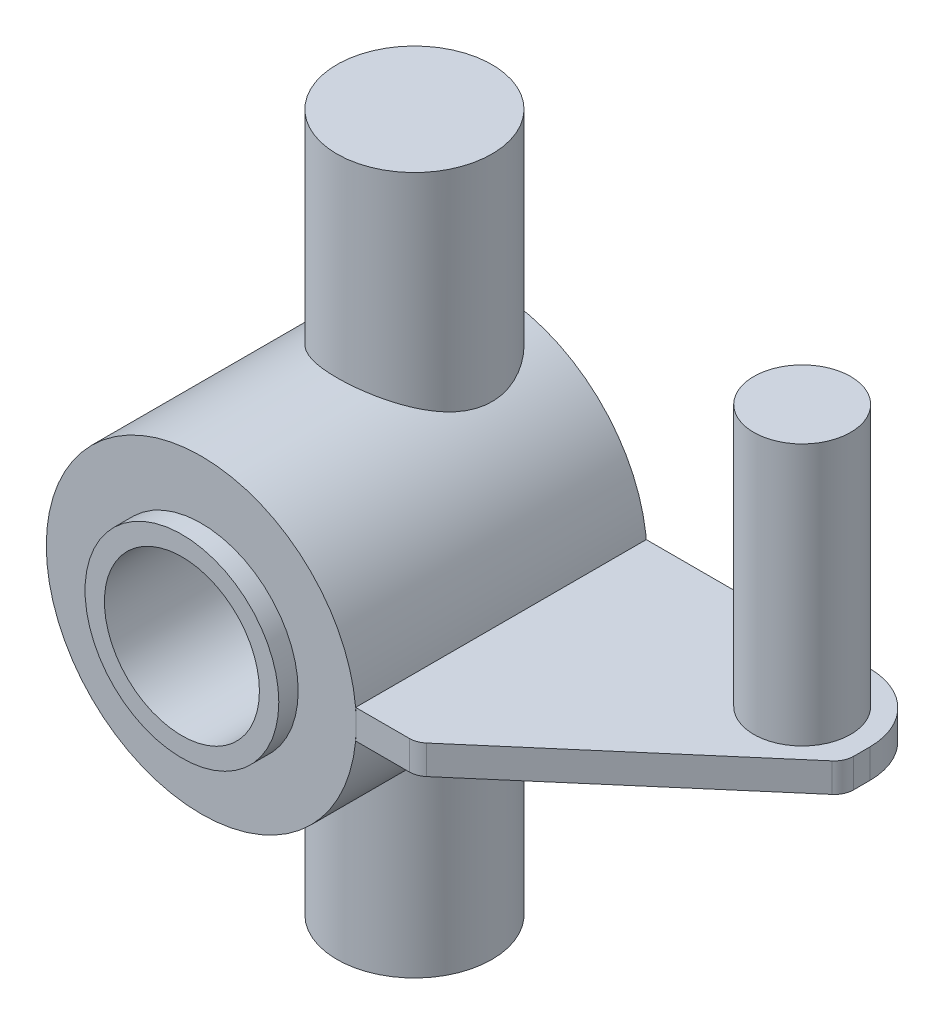
ISO-10303-21;
HEADER;
FILE_DESCRIPTION(('STEP AP214'),'2;1');
FILE_NAME('part.step','',(''),(''),'','','');
FILE_SCHEMA(('AUTOMOTIVE_DESIGN { 1 0 10303 214 1 1 1 1 }'));
ENDSEC;
DATA;
#1=APPLICATION_CONTEXT('core data for automotive mechanical design processes');
#2=APPLICATION_PROTOCOL_DEFINITION('international standard','automotive_design',2000,#1);
#3=PRODUCT_CONTEXT('',#1,'mechanical');
#4=PRODUCT('Part','Part','',(#3));
#5=PRODUCT_RELATED_PRODUCT_CATEGORY('part','',(#4));
#6=PRODUCT_DEFINITION_FORMATION('','',#4);
#7=PRODUCT_DEFINITION_CONTEXT('part definition',#1,'design');
#8=PRODUCT_DEFINITION('design','',#6,#7);
#9=PRODUCT_DEFINITION_SHAPE('','',#8);
#10=(LENGTH_UNIT() NAMED_UNIT(*) SI_UNIT(.MILLI.,.METRE.));
#11=(NAMED_UNIT(*) PLANE_ANGLE_UNIT() SI_UNIT($,.RADIAN.));
#12=(NAMED_UNIT(*) SI_UNIT($,.STERADIAN.) SOLID_ANGLE_UNIT());
#13=UNCERTAINTY_MEASURE_WITH_UNIT(LENGTH_MEASURE(1.E-05),#10,'distance_accuracy_value','');
#14=(GEOMETRIC_REPRESENTATION_CONTEXT(3) GLOBAL_UNCERTAINTY_ASSIGNED_CONTEXT((#13)) GLOBAL_UNIT_ASSIGNED_CONTEXT((#10,
#11,#12)) REPRESENTATION_CONTEXT('',''));
#15=CARTESIAN_POINT('',(0.,0.,0.));
#16=DIRECTION('',(0.,0.,1.));
#17=DIRECTION('',(1.,0.,0.));
#18=AXIS2_PLACEMENT_3D('',#15,#16,#17);
#19=CARTESIAN_POINT('',(23.,0.750000000000004,0.));
#20=DIRECTION('',(0.,-1.,0.));
#21=DIRECTION('',(0.,0.,-1.));
#22=AXIS2_PLACEMENT_3D('',#19,#20,#21);
#23=PLANE('',#22);
#24=CARTESIAN_POINT('',(19.4463189334762,0.750000000000002,3.43499495567666));
#25=DIRECTION('',(0.,-1.,0.));
#26=DIRECTION('',(0.,0.,-1.));
#27=AXIS2_PLACEMENT_3D('',#24,#25,#26);
#28=CIRCLE('',#27,2.5);
#29=CARTESIAN_POINT('',(19.4463189334762,0.750000000000003,0.934994955676659));
#30=VERTEX_POINT('',#29);
#31=EDGE_CURVE('E173',#30,#30,#28,.T.);
#32=ORIENTED_EDGE('',*,*,#31,.T.);
#33=EDGE_LOOP('',(#32));
#34=FACE_BOUND('',#33,.T.);
#35=DIRECTION('',(0.758813097039512,0.,-0.651308439805062));
#36=VECTOR('',#35,1.);
#37=CARTESIAN_POINT('',(25.3687248158512,0.750000000000003,2.75970539256084));
#38=LINE('',#37,#36);
#39=CARTESIAN_POINT('',(11.3890501755666,0.749999999999998,14.7588130970395));
#40=VERTEX_POINT('',#39);
#41=CARTESIAN_POINT('',(22.6513084398051,0.750000000000002,5.09213247781868));
#42=VERTEX_POINT('',#41);
#43=EDGE_CURVE('E121',#40,#42,#38,.T.);
#44=ORIENTED_EDGE('',*,*,#43,.T.);
#45=CARTESIAN_POINT('',(22.,0.750000000000002,4.33331938077917));
#46=DIRECTION('',(0.,-1.,0.));
#47=DIRECTION('',(0.,0.,-1.));
#48=AXIS2_PLACEMENT_3D('',#45,#46,#47);
#49=CIRCLE('',#48,1.);
#50=CARTESIAN_POINT('',(23.,0.750000000000002,4.33331938077917));
#51=VERTEX_POINT('',#50);
#52=EDGE_CURVE('E70',#42,#51,#49,.F.);
#53=ORIENTED_EDGE('',*,*,#52,.T.);
#54=DIRECTION('',(0.,0.,1.));
#55=VECTOR('',#54,1.);
#56=CARTESIAN_POINT('',(23.,0.750000000000004,0.));
#57=LINE('',#56,#55);
#58=CARTESIAN_POINT('',(23.,0.750000000000002,3.5));
#59=VERTEX_POINT('',#58);
#60=EDGE_CURVE('E141',#59,#51,#57,.T.);
#61=ORIENTED_EDGE('',*,*,#60,.F.);
#62=CARTESIAN_POINT('',(19.5,0.750000000000002,3.5));
#63=DIRECTION('',(0.,-1.,0.));
#64=DIRECTION('',(0.,0.,-1.));
#65=AXIS2_PLACEMENT_3D('',#62,#63,#64);
#66=CIRCLE('',#65,3.5);
#67=CARTESIAN_POINT('',(19.5,0.750000000000004,0.));
#68=VERTEX_POINT('',#67);
#69=EDGE_CURVE('E130',#68,#59,#66,.T.);
#70=ORIENTED_EDGE('',*,*,#69,.F.);
#71=DIRECTION('',(-1.,0.,0.));
#72=VECTOR('',#71,1.);
#73=CARTESIAN_POINT('',(23.,0.750000000000004,0.));
#74=LINE('',#73,#72);
#75=CARTESIAN_POINT('',(7.964766161037,0.749999999999998,0.));
#76=VERTEX_POINT('',#75);
#77=EDGE_CURVE('E129',#68,#76,#74,.T.);
#78=ORIENTED_EDGE('',*,*,#77,.T.);
#79=DIRECTION('',(0.,0.,-1.));
#80=VECTOR('',#79,1.);
#81=CARTESIAN_POINT('',(7.964766161037,0.749999999999998,15.));
#82=LINE('',#81,#80);
#83=CARTESIAN_POINT('',(7.964766161037,0.749999999999998,15.));
#84=VERTEX_POINT('',#83);
#85=EDGE_CURVE('E180',#76,#84,#82,.F.);
#86=ORIENTED_EDGE('',*,*,#85,.T.);
#87=DIRECTION('',(-1.,0.,0.));
#88=VECTOR('',#87,1.);
#89=CARTESIAN_POINT('',(23.,0.749999999999998,15.));
#90=LINE('',#89,#88);
#91=CARTESIAN_POINT('',(10.7377417357616,0.749999999999998,15.));
#92=VERTEX_POINT('',#91);
#93=EDGE_CURVE('E139',#92,#84,#90,.T.);
#94=ORIENTED_EDGE('',*,*,#93,.F.);
#95=CARTESIAN_POINT('',(10.7377417357616,0.749999999999999,14.));
#96=DIRECTION('',(0.,-1.,0.));
#97=DIRECTION('',(0.,0.,-1.));
#98=AXIS2_PLACEMENT_3D('',#95,#96,#97);
#99=CIRCLE('',#98,1.);
#100=EDGE_CURVE('E155',#92,#40,#99,.F.);
#101=ORIENTED_EDGE('',*,*,#100,.T.);
#102=EDGE_LOOP('',(#44,#53,#61,#70,#78,#86,#94,#101));
#103=FACE_BOUND('',#102,.T.);
#104=ADVANCED_FACE('F48',(#34,#103),#23,.F.);
#105=CARTESIAN_POINT('',(23.,-0.750000000000004,0.));
#106=DIRECTION('',(0.,1.,0.));
#107=DIRECTION('',(0.,0.,1.));
#108=AXIS2_PLACEMENT_3D('',#105,#106,#107);
#109=PLANE('',#108);
#110=DIRECTION('',(0.,0.,-1.));
#111=VECTOR('',#110,1.);
#112=CARTESIAN_POINT('',(23.,-0.750000000000004,0.));
#113=LINE('',#112,#111);
#114=CARTESIAN_POINT('',(23.,-0.750000000000003,4.33331938077917));
#115=VERTEX_POINT('',#114);
#116=CARTESIAN_POINT('',(23.,-0.750000000000003,3.5));
#117=VERTEX_POINT('',#116);
#118=EDGE_CURVE('E137',#115,#117,#113,.T.);
#119=ORIENTED_EDGE('',*,*,#118,.F.);
#120=CARTESIAN_POINT('',(22.,-0.750000000000004,4.33331938077917));
#121=DIRECTION('',(0.,1.,0.));
#122=DIRECTION('',(0.,0.,1.));
#123=AXIS2_PLACEMENT_3D('',#120,#121,#122);
#124=CIRCLE('',#123,1.);
#125=CARTESIAN_POINT('',(22.6513084398051,-0.750000000000003,5.09213247781868));
#126=VERTEX_POINT('',#125);
#127=EDGE_CURVE('E12',#115,#126,#124,.F.);
#128=ORIENTED_EDGE('',*,*,#127,.T.);
#129=DIRECTION('',(0.758813097039512,0.,-0.651308439805062));
#130=VECTOR('',#129,1.);
#131=CARTESIAN_POINT('',(12.1253865423612,-0.750000000000002,14.1267970022992));
#132=LINE('',#131,#130);
#133=CARTESIAN_POINT('',(11.3890501755666,-0.750000000000002,14.7588130970395));
#134=VERTEX_POINT('',#133);
#135=EDGE_CURVE('E167',#134,#126,#132,.T.);
#136=ORIENTED_EDGE('',*,*,#135,.F.);
#137=CARTESIAN_POINT('',(10.7377417357616,-0.750000000000002,14.));
#138=DIRECTION('',(0.,1.,0.));
#139=DIRECTION('',(0.,0.,1.));
#140=AXIS2_PLACEMENT_3D('',#137,#138,#139);
#141=CIRCLE('',#140,1.);
#142=CARTESIAN_POINT('',(10.7377417357616,-0.750000000000002,15.));
#143=VERTEX_POINT('',#142);
#144=EDGE_CURVE('E151',#134,#143,#141,.F.);
#145=ORIENTED_EDGE('',*,*,#144,.T.);
#146=DIRECTION('',(-1.,0.,0.));
#147=VECTOR('',#146,1.);
#148=CARTESIAN_POINT('',(23.,-0.750000000000002,15.));
#149=LINE('',#148,#147);
#150=CARTESIAN_POINT('',(7.964766161037,-0.750000000000002,15.));
#151=VERTEX_POINT('',#150);
#152=EDGE_CURVE('E136',#143,#151,#149,.T.);
#153=ORIENTED_EDGE('',*,*,#152,.T.);
#154=DIRECTION('',(0.,0.,-1.));
#155=VECTOR('',#154,1.);
#156=CARTESIAN_POINT('',(7.96476616103699,-0.750000000000002,15.));
#157=LINE('',#156,#155);
#158=CARTESIAN_POINT('',(7.964766161037,-0.750000000000002,0.));
#159=VERTEX_POINT('',#158);
#160=EDGE_CURVE('E135',#151,#159,#157,.T.);
#161=ORIENTED_EDGE('',*,*,#160,.T.);
#162=DIRECTION('',(-1.,0.,0.));
#163=VECTOR('',#162,1.);
#164=CARTESIAN_POINT('',(23.,-0.750000000000004,0.));
#165=LINE('',#164,#163);
#166=CARTESIAN_POINT('',(19.5,-0.750000000000004,0.));
#167=VERTEX_POINT('',#166);
#168=EDGE_CURVE('E127',#167,#159,#165,.T.);
#169=ORIENTED_EDGE('',*,*,#168,.F.);
#170=CARTESIAN_POINT('',(19.5,-0.750000000000003,3.5));
#171=DIRECTION('',(0.,-1.,0.));
#172=DIRECTION('',(0.,0.,-1.));
#173=AXIS2_PLACEMENT_3D('',#170,#171,#172);
#174=CIRCLE('',#173,3.5);
#175=EDGE_CURVE('E112',#167,#117,#174,.T.);
#176=ORIENTED_EDGE('',*,*,#175,.T.);
#177=EDGE_LOOP('',(#119,#128,#136,#145,#153,#161,#169,#176));
#178=FACE_BOUND('',#177,.T.);
#179=ADVANCED_FACE('F133',(#178),#109,.F.);
#180=CARTESIAN_POINT('',(23.,-0.750000000000004,0.));
#181=DIRECTION('',(0.,0.,1.));
#182=DIRECTION('',(0.,-1.,0.));
#183=AXIS2_PLACEMENT_3D('',#180,#181,#182);
#184=PLANE('',#183);
#185=ORIENTED_EDGE('',*,*,#77,.F.);
#186=DIRECTION('',(0.,-1.,0.));
#187=VECTOR('',#186,1.);
#188=CARTESIAN_POINT('',(19.5,14.25,0.));
#189=LINE('',#188,#187);
#190=EDGE_CURVE('E115',#68,#167,#189,.T.);
#191=ORIENTED_EDGE('',*,*,#190,.T.);
#192=ORIENTED_EDGE('',*,*,#168,.T.);
#193=CARTESIAN_POINT('',(0.,0.,0.));
#194=DIRECTION('',(0.,0.,-1.));
#195=DIRECTION('',(0.,1.,0.));
#196=AXIS2_PLACEMENT_3D('',#193,#194,#195);
#197=CIRCLE('',#196,8.);
#198=EDGE_CURVE('E179',#159,#76,#197,.F.);
#199=ORIENTED_EDGE('',*,*,#198,.T.);
#200=EDGE_LOOP('',(#185,#191,#192,#199));
#201=FACE_BOUND('',#200,.T.);
#202=ADVANCED_FACE('F125',(#201),#184,.F.);
#203=CARTESIAN_POINT('',(23.,-0.750000000000002,15.));
#204=DIRECTION('',(0.,0.,-1.));
#205=DIRECTION('',(-1.,0.,0.));
#206=AXIS2_PLACEMENT_3D('',#203,#204,#205);
#207=PLANE('',#206);
#208=ORIENTED_EDGE('',*,*,#152,.F.);
#209=DIRECTION('',(0.,-1.,0.));
#210=VECTOR('',#209,1.);
#211=CARTESIAN_POINT('',(10.7377417357616,-0.750000000000004,15.));
#212=LINE('',#211,#210);
#213=EDGE_CURVE('E153',#143,#92,#212,.F.);
#214=ORIENTED_EDGE('',*,*,#213,.T.);
#215=ORIENTED_EDGE('',*,*,#93,.T.);
#216=CARTESIAN_POINT('',(0.,0.,15.));
#217=DIRECTION('',(0.,0.,1.));
#218=DIRECTION('',(1.,0.,0.));
#219=AXIS2_PLACEMENT_3D('',#216,#217,#218);
#220=CIRCLE('',#219,8.);
#221=EDGE_CURVE('E183',#84,#151,#220,.F.);
#222=ORIENTED_EDGE('',*,*,#221,.T.);
#223=EDGE_LOOP('',(#208,#214,#215,#222));
#224=FACE_BOUND('',#223,.T.);
#225=ADVANCED_FACE('F191',(#224),#207,.F.);
#226=CARTESIAN_POINT('',(23.,0.,0.));
#227=DIRECTION('',(1.,0.,0.));
#228=DIRECTION('',(0.,0.,-1.));
#229=AXIS2_PLACEMENT_3D('',#226,#227,#228);
#230=PLANE('',#229);
#231=ORIENTED_EDGE('',*,*,#60,.T.);
#232=DIRECTION('',(0.,1.,0.));
#233=VECTOR('',#232,1.);
#234=CARTESIAN_POINT('',(23.,-0.750000000000002,4.33331938077917));
#235=LINE('',#234,#233);
#236=EDGE_CURVE('E56',#51,#115,#235,.F.);
#237=ORIENTED_EDGE('',*,*,#236,.T.);
#238=ORIENTED_EDGE('',*,*,#118,.T.);
#239=DIRECTION('',(0.,-1.,0.));
#240=VECTOR('',#239,1.);
#241=CARTESIAN_POINT('',(23.,14.25,3.5));
#242=LINE('',#241,#240);
#243=EDGE_CURVE('E118',#59,#117,#242,.T.);
#244=ORIENTED_EDGE('',*,*,#243,.F.);
#245=EDGE_LOOP('',(#231,#237,#238,#244));
#246=FACE_BOUND('',#245,.T.);
#247=ADVANCED_FACE('F186',(#246),#230,.T.);
#248=CARTESIAN_POINT('',(0.,0.,15.));
#249=DIRECTION('',(0.,0.,-1.));
#250=DIRECTION('',(-1.,0.,0.));
#251=AXIS2_PLACEMENT_3D('',#248,#249,#250);
#252=CYLINDRICAL_SURFACE('',#251,8.);
#253=ORIENTED_EDGE('',*,*,#198,.F.);
#254=ORIENTED_EDGE('',*,*,#160,.F.);
#255=ORIENTED_EDGE('',*,*,#221,.F.);
#256=ORIENTED_EDGE('',*,*,#85,.F.);
#257=EDGE_LOOP('',(#253,#254,#255,#256));
#258=FACE_BOUND('',#257,.T.);
#259=ADVANCED_FACE('F218',(#258),#252,.F.);
#260=CARTESIAN_POINT('',(19.5,14.25,3.5));
#261=DIRECTION('',(0.,-1.,0.));
#262=DIRECTION('',(0.,0.,-1.));
#263=AXIS2_PLACEMENT_3D('',#260,#261,#262);
#264=CYLINDRICAL_SURFACE('',#263,3.5);
#265=ORIENTED_EDGE('',*,*,#69,.T.);
#266=ORIENTED_EDGE('',*,*,#243,.T.);
#267=ORIENTED_EDGE('',*,*,#175,.F.);
#268=ORIENTED_EDGE('',*,*,#190,.F.);
#269=EDGE_LOOP('',(#265,#266,#267,#268));
#270=FACE_BOUND('',#269,.T.);
#271=ADVANCED_FACE('F114',(#270),#264,.T.);
#272=CARTESIAN_POINT('',(12.1253865423612,14.25,14.1267970022992));
#273=DIRECTION('',(-0.651308439805062,0.,-0.758813097039512));
#274=DIRECTION('',(-0.758813097039512,0.,0.651308439805062));
#275=AXIS2_PLACEMENT_3D('',#272,#273,#274);
#276=PLANE('',#275);
#277=ORIENTED_EDGE('',*,*,#135,.T.);
#278=DIRECTION('',(0.,1.,0.));
#279=VECTOR('',#278,1.);
#280=CARTESIAN_POINT('',(22.6513084398051,0.750000000000003,5.09213247781868));
#281=LINE('',#280,#279);
#282=EDGE_CURVE('E157',#126,#42,#281,.T.);
#283=ORIENTED_EDGE('',*,*,#282,.T.);
#284=ORIENTED_EDGE('',*,*,#43,.F.);
#285=DIRECTION('',(0.,-1.,0.));
#286=VECTOR('',#285,1.);
#287=CARTESIAN_POINT('',(11.3890501755666,14.25,14.7588130970395));
#288=LINE('',#287,#286);
#289=EDGE_CURVE('E148',#40,#134,#288,.T.);
#290=ORIENTED_EDGE('',*,*,#289,.T.);
#291=EDGE_LOOP('',(#277,#283,#284,#290));
#292=FACE_BOUND('',#291,.T.);
#293=ADVANCED_FACE('F164',(#292),#276,.F.);
#294=CARTESIAN_POINT('',(10.7377417357616,14.25,14.));
#295=DIRECTION('',(0.,-1.,0.));
#296=DIRECTION('',(1.,0.,0.));
#297=AXIS2_PLACEMENT_3D('',#294,#295,#296);
#298=CYLINDRICAL_SURFACE('',#297,1.);
#299=ORIENTED_EDGE('',*,*,#100,.F.);
#300=ORIENTED_EDGE('',*,*,#213,.F.);
#301=ORIENTED_EDGE('',*,*,#144,.F.);
#302=ORIENTED_EDGE('',*,*,#289,.F.);
#303=EDGE_LOOP('',(#299,#300,#301,#302));
#304=FACE_BOUND('',#303,.T.);
#305=ADVANCED_FACE('F193',(#304),#298,.T.);
#306=CARTESIAN_POINT('',(22.,14.25,4.33331938077917));
#307=DIRECTION('',(0.,-1.,0.));
#308=DIRECTION('',(0.,0.,-1.));
#309=AXIS2_PLACEMENT_3D('',#306,#307,#308);
#310=CYLINDRICAL_SURFACE('',#309,1.);
#311=ORIENTED_EDGE('',*,*,#127,.F.);
#312=ORIENTED_EDGE('',*,*,#236,.F.);
#313=ORIENTED_EDGE('',*,*,#52,.F.);
#314=ORIENTED_EDGE('',*,*,#282,.F.);
#315=EDGE_LOOP('',(#311,#312,#313,#314));
#316=FACE_BOUND('',#315,.T.);
#317=ADVANCED_FACE('F50',(#316),#310,.T.);
#318=CARTESIAN_POINT('',(19.4463189334762,14.25,3.43499495567666));
#319=DIRECTION('',(0.,-1.,0.));
#320=DIRECTION('',(0.,0.,-1.));
#321=AXIS2_PLACEMENT_3D('',#318,#319,#320);
#322=CYLINDRICAL_SURFACE('',#321,2.5);
#323=CARTESIAN_POINT('',(19.4463189334762,14.25,3.43499495567666));
#324=DIRECTION('',(0.,-1.,0.));
#325=DIRECTION('',(0.,0.,-1.));
#326=AXIS2_PLACEMENT_3D('',#323,#324,#325);
#327=CIRCLE('',#326,2.5);
#328=CARTESIAN_POINT('',(19.4463189334762,14.25,0.934994955676657));
#329=VERTEX_POINT('',#328);
#330=EDGE_CURVE('E238',#329,#329,#327,.T.);
#331=ORIENTED_EDGE('',*,*,#330,.T.);
#332=EDGE_LOOP('',(#331));
#333=FACE_BOUND('',#332,.T.);
#334=ORIENTED_EDGE('',*,*,#31,.F.);
#335=EDGE_LOOP('',(#334));
#336=FACE_BOUND('',#335,.T.);
#337=ADVANCED_FACE('F199',(#333,#336),#322,.T.);
#338=CARTESIAN_POINT('',(19.4463189334762,14.25,3.43499495567666));
#339=DIRECTION('',(0.,-1.,0.));
#340=DIRECTION('',(0.,0.,-1.));
#341=AXIS2_PLACEMENT_3D('',#338,#339,#340);
#342=PLANE('',#341);
#343=ORIENTED_EDGE('',*,*,#330,.F.);
#344=EDGE_LOOP('',(#343));
#345=FACE_BOUND('',#344,.T.);
#346=ADVANCED_FACE('F230',(#345),#342,.F.);
#347=CLOSED_SHELL('',(#104,#179,#202,#225,#247,#259,#271,#293,#305,#317,#337,#346));
#348=MANIFOLD_SOLID_BREP('B2',#347);
#349=CARTESIAN_POINT('',(0.,18.,4.));
#350=DIRECTION('',(0.,-1.,0.));
#351=DIRECTION('',(0.,0.,-1.));
#352=AXIS2_PLACEMENT_3D('',#349,#350,#351);
#353=CYLINDRICAL_SURFACE('',#352,4.);
#354=CARTESIAN_POINT('',(0.,18.,4.));
#355=DIRECTION('',(0.,1.,0.));
#356=DIRECTION('',(0.,0.,1.));
#357=AXIS2_PLACEMENT_3D('',#354,#355,#356);
#358=CIRCLE('',#357,4.);
#359=CARTESIAN_POINT('',(0.,18.,8.));
#360=VERTEX_POINT('',#359);
#361=EDGE_CURVE('E47',#360,#360,#358,.T.);
#362=ORIENTED_EDGE('',*,*,#361,.F.);
#363=EDGE_LOOP('',(#362));
#364=FACE_BOUND('',#363,.T.);
#365=CARTESIAN_POINT('',(0.,8.,8.));
#366=CARTESIAN_POINT('',(0.105191216468488,7.99999964432188,7.99999959515221));
#367=CARTESIAN_POINT('',(0.210389995368427,7.99792027620652,7.99584554268467));
#368=CARTESIAN_POINT('',(0.420011249701336,7.98965597150982,7.97927792190077));
#369=CARTESIAN_POINT('',(0.524433367425618,7.98346924887743,7.96686076043045));
#370=CARTESIAN_POINT('',(0.731828138370605,7.96713597659603,7.93388648530473));
#371=CARTESIAN_POINT('',(0.834798506711917,7.95698378017499,7.9133177633431));
#372=CARTESIAN_POINT('',(1.0384152051955,7.93298382243633,7.86428279244356));
#373=CARTESIAN_POINT('',(1.1390605669938,7.91913455043164,7.83581331493588));
#374=CARTESIAN_POINT('',(1.43561775388138,7.87265974292142,7.73925176888222));
#375=CARTESIAN_POINT('',(1.6271962065847,7.83501976471674,7.65983701915264));
#376=CARTESIAN_POINT('',(1.99392146995421,7.74982886318845,7.47371095891235));
#377=CARTESIAN_POINT('',(2.16906957469774,7.70227872135526,7.36700180061893));
#378=CARTESIAN_POINT('',(2.51002321260362,7.59825056785886,7.12193017740055));
#379=CARTESIAN_POINT('',(2.67462250306452,7.54140647262265,6.98204331180567));
#380=CARTESIAN_POINT('',(2.97911611963431,7.42640030348014,6.67792486241435));
#381=CARTESIAN_POINT('',(3.11899161990724,7.3682372629647,6.51367490095672));
#382=CARTESIAN_POINT('',(3.38102385527715,7.25195135134797,6.15002101287013));
#383=CARTESIAN_POINT('',(3.50096528772936,7.19418138823907,5.94887869572524));
#384=CARTESIAN_POINT('',(3.65378721735264,7.11709930290977,5.63206546004573));
#385=CARTESIAN_POINT('',(3.70022392693971,7.09299422837207,5.5239053371934));
#386=CARTESIAN_POINT('',(3.78359067078057,7.04887690211806,5.30319902892111));
#387=CARTESIAN_POINT('',(3.82052633371565,7.02886222858683,5.19065548607789));
#388=CARTESIAN_POINT('',(3.88251046204454,6.9948044998643,4.96880578069376));
#389=CARTESIAN_POINT('',(3.9081340887804,6.9804776446802,4.85970358083543));
#390=CARTESIAN_POINT('',(3.95018060072941,6.95677065788593,4.63925947717983));
#391=CARTESIAN_POINT('',(3.96660836750271,6.9473879018896,4.52791879424739));
#392=CARTESIAN_POINT('',(3.99001913809428,6.93396933490057,4.30399390653389));
#393=CARTESIAN_POINT('',(3.99700782997252,6.92993030376772,4.19141049191159));
#394=CARTESIAN_POINT('',(4.00144340059851,6.92737022415464,3.96599952196127));
#395=CARTESIAN_POINT('',(3.99889118971828,6.92884864921082,3.853171990953));
#396=CARTESIAN_POINT('',(3.98516575152016,6.93675038555112,3.64183562155368));
#397=CARTESIAN_POINT('',(3.97506329407581,6.94255931040713,3.54323256042783));
#398=CARTESIAN_POINT('',(3.94763759493625,6.95818925294571,3.34734838783369));
#399=CARTESIAN_POINT('',(3.93031208534669,6.96801153072177,3.2500677014795));
#400=CARTESIAN_POINT('',(3.86777248849784,7.00304835203764,2.96122086709978));
#401=CARTESIAN_POINT('',(3.81198555026409,7.03383903740602,2.77250454291879));
#402=CARTESIAN_POINT('',(3.67283599572519,7.10749917506982,2.4030536672292));
#403=CARTESIAN_POINT('',(3.58886132884632,7.15063327143764,2.22260742465183));
#404=CARTESIAN_POINT('',(3.39616568981264,7.2441365265382,1.87746981298511));
#405=CARTESIAN_POINT('',(3.28743360222607,7.29450893132236,1.71278556793507));
#406=CARTESIAN_POINT('',(3.03227252755196,7.40452458073482,1.38191711829539));
#407=CARTESIAN_POINT('',(2.88281182497071,7.46453347888883,1.21819042929159));
#408=CARTESIAN_POINT('',(2.55818830727484,7.58191186589975,0.917040393499512));
#409=CARTESIAN_POINT('',(2.38301327894514,7.63928008344308,0.779629617525468));
#410=CARTESIAN_POINT('',(2.09944472683198,7.7202760768617,0.593246969785754));
#411=CARTESIAN_POINT('',(1.9989679987013,7.74696304862188,0.533318240246936));
#412=CARTESIAN_POINT('',(1.79256850112001,7.79730441532266,0.42223352122335));
#413=CARTESIAN_POINT('',(1.68664805204876,7.82096008757468,0.37107383360208));
#414=CARTESIAN_POINT('',(1.47010242051538,7.86454042959534,0.278080877627199));
#415=CARTESIAN_POINT('',(1.35947915341347,7.88446660078232,0.236243854867457));
#416=CARTESIAN_POINT('',(1.13432950721217,7.91999221203723,0.162380061448199));
#417=CARTESIAN_POINT('',(1.01980357880328,7.9355921498224,0.130352162240849));
#418=CARTESIAN_POINT('',(0.797438403015335,7.96087677585623,0.0787731521448827));
#419=CARTESIAN_POINT('',(0.68983090685457,7.9709443603734,0.058408402943018));
#420=CARTESIAN_POINT('',(0.472998720376382,7.98674429615844,0.0265535517575012));
#421=CARTESIAN_POINT('',(0.363774173887724,7.99247703065614,0.0150626652629393));
#422=CARTESIAN_POINT('',(0.144648447401173,7.99944300548302,0.00110952845549016));
#423=CARTESIAN_POINT('',(0.0347475425961453,8.00067796839692,-0.00135617837901456));
#424=CARTESIAN_POINT('',(-0.184837638972486,7.99861804620746,0.00276424211008771));
#425=CARTESIAN_POINT('',(-0.294521925108021,7.99532336157662,0.00934996883659231));
#426=CARTESIAN_POINT('',(-0.504259611746538,7.98472734940324,0.0306235695271645));
#427=CARTESIAN_POINT('',(-0.604398259266984,7.97775776257091,0.0446410691044307));
#428=CARTESIAN_POINT('',(-0.803035609307668,7.96021983565123,0.0801363996639103));
#429=CARTESIAN_POINT('',(-0.901533743070587,7.94965027363514,0.101616763793442));
#430=CARTESIAN_POINT('',(-1.19351737727532,7.91289127905722,0.176935173599938));
#431=CARTESIAN_POINT('',(-1.38368108667204,7.88164133135127,0.241670140590663));
#432=CARTESIAN_POINT('',(-1.75558493783058,7.80736894774679,0.399998108905637));
#433=CARTESIAN_POINT('',(-1.93692876519228,7.76403545540105,0.494363309171963));
#434=CARTESIAN_POINT('',(-2.28183826656572,7.66975878800211,0.708431034259749));
#435=CARTESIAN_POINT('',(-2.44539632212196,7.61881237399843,0.828144352631561));
#436=CARTESIAN_POINT('',(-2.76706877708067,7.50833088367007,1.10303311970347));
#437=CARTESIAN_POINT('',(-2.92307134240145,7.44844369061623,1.26053653725913));
#438=CARTESIAN_POINT('',(-3.20744226426287,7.33048735856255,1.5997355652547));
#439=CARTESIAN_POINT('',(-3.33579150415337,7.27241950081065,1.7814477716031));
#440=CARTESIAN_POINT('',(-3.50772930633183,7.19028164087441,2.0739940144221));
#441=CARTESIAN_POINT('',(-3.5626157867948,7.16316684054651,2.17748375843627));
#442=CARTESIAN_POINT('',(-3.66334616154282,7.11217812644117,2.38951843531651));
#443=CARTESIAN_POINT('',(-3.70919441458265,7.08830265221425,2.49806090009515));
#444=CARTESIAN_POINT('',(-3.79131200961919,7.04472262103751,2.71942164536428));
#445=CARTESIAN_POINT('',(-3.82758904080802,7.02501471854545,2.83223640979536));
#446=CARTESIAN_POINT('',(-3.89012004539429,6.9905825381999,3.06135278907153));
#447=CARTESIAN_POINT('',(-3.91637557070638,6.97585748874971,3.17765386102154));
#448=CARTESIAN_POINT('',(-3.95643062416587,6.95321025619991,3.40141213316309));
#449=CARTESIAN_POINT('',(-3.97118378192521,6.94477079792059,3.50864683290839));
#450=CARTESIAN_POINT('',(-3.99195118317071,6.93285441469714,3.72422767020064));
#451=CARTESIAN_POINT('',(-3.99796634225491,6.92937696981658,3.8325736901013));
#452=CARTESIAN_POINT('',(-4.00116308319383,6.92753208063799,4.04940749673038));
#453=CARTESIAN_POINT('',(-3.99834777004019,6.9291628401807,4.15789522022328));
#454=CARTESIAN_POINT('',(-3.98394653809981,6.9374509348198,4.37406114711354));
#455=CARTESIAN_POINT('',(-3.97236097836303,6.94410806413885,4.48173938346867));
#456=CARTESIAN_POINT('',(-3.92770249100378,6.96952879582861,4.7818001370413));
#457=CARTESIAN_POINT('',(-3.88483285002042,6.99372760142387,4.97236586731381));
#458=CARTESIAN_POINT('',(-3.77270184038046,7.05483682415845,5.34326850255324));
#459=CARTESIAN_POINT('',(-3.70343198216887,7.09175132993569,5.52360209570391));
#460=CARTESIAN_POINT('',(-3.53526338936952,7.17714225279385,5.882488553514));
#461=CARTESIAN_POINT('',(-3.43468670285354,7.22622883383996,6.06010777576172));
#462=CARTESIAN_POINT('',(-3.20860173383709,7.3294133274236,6.39710197827703));
#463=CARTESIAN_POINT('',(-3.08308048046464,7.38351383930109,6.55646739854074));
#464=CARTESIAN_POINT('',(-2.79282250805389,7.49849148240842,6.8725629090385));
#465=CARTESIAN_POINT('',(-2.62517402605099,7.55939328373464,7.02661992962373));
#466=CARTESIAN_POINT('',(-2.26458287075638,7.67511613929542,7.3050684228129));
#467=CARTESIAN_POINT('',(-2.07162664990559,7.72993390744395,7.42944390524207));
#468=CARTESIAN_POINT('',(-1.76603106757846,7.80335210517359,7.59090424941519));
#469=CARTESIAN_POINT('',(-1.66100410373827,7.82643367929072,7.64069364140905));
#470=CARTESIAN_POINT('',(-1.44639623629744,7.8689179624278,7.73114894700146));
#471=CARTESIAN_POINT('',(-1.33681760142932,7.88832247803741,7.77181934269804));
#472=CARTESIAN_POINT('',(-1.11415600876093,7.92283587265691,7.84347634443401));
#473=CARTESIAN_POINT('',(-1.00108129646084,7.93795411409434,7.87448407138671));
#474=CARTESIAN_POINT('',(-0.772189766950842,7.96347694583626,7.92651008001648));
#475=CARTESIAN_POINT('',(-0.656374670304615,7.97388441530454,7.94753446377235));
#476=CARTESIAN_POINT('',(-0.450433316283305,7.98781110043795,7.97557962119869));
#477=CARTESIAN_POINT('',(-0.360660623567813,7.99237392421376,7.98472938917604));
#478=CARTESIAN_POINT('',(-0.180593821057088,7.99846856848791,7.99693983637807));
#479=CARTESIAN_POINT('',(-0.0902996969389666,8.00000030532612,8.00000034753503));
#480=CARTESIAN_POINT('',(0.,8.,8.));
#481=B_SPLINE_CURVE_WITH_KNOTS('',3,(#365,#366,#367,#368,#369,#370,#371,#372,#373,#374,#375,
#376,#377,#378,#379,#380,#381,#382,#383,#384,#385,#386,#387,#388,#389,#390,#391,#392,#393,#394,
#395,#396,#397,#398,#399,#400,#401,#402,#403,#404,#405,#406,#407,#408,#409,#410,#411,#412,#413,
#414,#415,#416,#417,#418,#419,#420,#421,#422,#423,#424,#425,#426,#427,#428,#429,#430,#431,#432,
#433,#434,#435,#436,#437,#438,#439,#440,#441,#442,#443,#444,#445,#446,#447,#448,#449,#450,#451,
#452,#453,#454,#455,#456,#457,#458,#459,#460,#461,#462,#463,#464,#465,#466,#467,#468,#469,#470,
#471,#472,#473,#474,#475,#476,#477,#478,#479,#480),.UNSPECIFIED.,.T.,.F.,(4,2,2,2,2,2,2,2,2,2,2,
2,2,2,2,2,2,2,2,2,2,2,2,2,2,2,2,2,2,2,2,2,2,2,2,2,2,2,2,2,2,2,2,2,2,2,2,2,2,2,2,2,2,2,2,2,2,4),
(0.,0.315484235719912,0.631105747230253,0.947178346952276,1.26338029745354,1.89263632058595,
2.52184274094302,3.18911473348911,3.85689264923289,4.57645675584686,4.93648208726456,
5.29629363598333,5.63476191634051,5.97305035229576,6.31113484191767,6.64918707308226,
6.94669148652859,7.24428938086225,7.83905304157541,8.44767049128776,9.05656173495714,
9.74265853790341,10.4290822684957,10.7886699173095,11.1481055433964,11.5073961555811,
11.8666454155399,12.1961419049363,12.5256092612256,12.8549504227676,13.184277008843,
13.4879760335491,13.791778244799,14.3988188497914,15.02321622567,15.6478800144877,
16.33388641032,17.0203655291613,17.380682030865,17.7408243397693,18.1006764355618,
18.4604727825931,18.7857371805984,19.1109674938045,19.4360834615763,19.7611861199664,
20.3488209353335,20.9366448769134,21.5639619965908,22.1916061711245,22.8955134356508,
23.5997990605888,23.9548906509477,24.3098073249809,24.6639426811876,25.0178613011449,
25.2886761616556,25.5594984967416),.UNSPECIFIED.);
#482=CARTESIAN_POINT('',(0.,8.,8.));
#483=VERTEX_POINT('',#482);
#484=EDGE_CURVE('E324',#483,#483,#481,.T.);
#485=ORIENTED_EDGE('',*,*,#484,.T.);
#486=EDGE_LOOP('',(#485));
#487=FACE_BOUND('',#486,.T.);
#488=ADVANCED_FACE('F318',(#364,#487),#353,.T.);
#489=CARTESIAN_POINT('',(0.,18.,4.));
#490=DIRECTION('',(0.,1.,0.));
#491=DIRECTION('',(0.,0.,1.));
#492=AXIS2_PLACEMENT_3D('',#489,#490,#491);
#493=PLANE('',#492);
#494=ORIENTED_EDGE('',*,*,#361,.T.);
#495=EDGE_LOOP('',(#494));
#496=FACE_BOUND('',#495,.T.);
#497=ADVANCED_FACE('F339',(#496),#493,.T.);
#498=CARTESIAN_POINT('',(0.,0.,15.));
#499=DIRECTION('',(0.,0.,-1.));
#500=DIRECTION('',(-1.,0.,0.));
#501=AXIS2_PLACEMENT_3D('',#498,#499,#500);
#502=CYLINDRICAL_SURFACE('',#501,8.);
#503=ORIENTED_EDGE('',*,*,#484,.F.);
#504=EDGE_LOOP('',(#503));
#505=FACE_BOUND('',#504,.T.);
#506=ADVANCED_FACE('F336',(#505),#502,.F.);
#507=CLOSED_SHELL('',(#488,#497,#506));
#508=MANIFOLD_SOLID_BREP('B6',#507);
#509=CARTESIAN_POINT('',(0.,0.,15.));
#510=DIRECTION('',(0.,0.,-1.));
#511=DIRECTION('',(-1.,0.,0.));
#512=AXIS2_PLACEMENT_3D('',#509,#510,#511);
#513=CYLINDRICAL_SURFACE('',#512,8.);
#514=CARTESIAN_POINT('',(0.,0.,15.));
#515=DIRECTION('',(0.,0.,1.));
#516=DIRECTION('',(1.,0.,0.));
#517=AXIS2_PLACEMENT_3D('',#514,#515,#516);
#518=CIRCLE('',#517,8.);
#519=CARTESIAN_POINT('',(8.,0.,15.));
#520=VERTEX_POINT('',#519);
#521=EDGE_CURVE('E316',#520,#520,#518,.T.);
#522=ORIENTED_EDGE('',*,*,#521,.F.);
#523=EDGE_LOOP('',(#522));
#524=FACE_BOUND('',#523,.T.);
#525=CARTESIAN_POINT('',(0.,0.,0.));
#526=DIRECTION('',(0.,0.,1.));
#527=DIRECTION('',(1.,0.,0.));
#528=AXIS2_PLACEMENT_3D('',#525,#526,#527);
#529=CIRCLE('',#528,8.);
#530=CARTESIAN_POINT('',(0.,-8.,0.));
#531=VERTEX_POINT('',#530);
#532=EDGE_CURVE('E371',#531,#531,#529,.T.);
#533=ORIENTED_EDGE('',*,*,#532,.T.);
#534=CARTESIAN_POINT('',(4.00000000000001,-6.9282032302755,4.));
#535=CARTESIAN_POINT('',(3.99999950219345,-6.92820386262826,4.1042653254373));
#536=CARTESIAN_POINT('',(3.9959176319954,-6.93056511456488,4.20853992667939));
#537=CARTESIAN_POINT('',(3.97964472112407,-6.93992172463862,4.41628417460038));
#538=CARTESIAN_POINT('',(3.96744990521399,-6.94691924018481,4.51975342383269));
#539=CARTESIAN_POINT('',(3.93508538297522,-6.96530330045203,4.72521084556988));
#540=CARTESIAN_POINT('',(3.91490316893164,-6.97669672816262,4.82719643382953));
#541=CARTESIAN_POINT('',(3.86682062971259,-7.00345973447504,5.02881400167829));
#542=CARTESIAN_POINT('',(3.83891695064122,-7.01883104071991,5.12844493804267));
#543=CARTESIAN_POINT('',(3.74442772916635,-7.06996541785761,5.42168896600919));
#544=CARTESIAN_POINT('',(3.66684915651286,-7.11087904783325,5.61098585661696));
#545=CARTESIAN_POINT('',(3.4850607538011,-7.20170927952067,5.97372956380103));
#546=CARTESIAN_POINT('',(3.38084948302617,-7.25162636823861,6.14717552221941));
#547=CARTESIAN_POINT('',(3.13867639492106,-7.3598722626408,6.48920849434794));
#548=CARTESIAN_POINT('',(2.99863981046009,-7.41855528289904,6.65621486644762));
#549=CARTESIAN_POINT('',(2.69298354883076,-7.53488657765781,6.96565524064934));
#550=CARTESIAN_POINT('',(2.52735118809494,-7.59253432325008,7.10807698576393));
#551=CARTESIAN_POINT('',(2.25626437810993,-7.6758759355965,7.30498206648215));
#552=CARTESIAN_POINT('',(2.15870290429516,-7.70394919240218,7.36953226161913));
#553=CARTESIAN_POINT('',(1.95777427065883,-7.75744193796062,7.49010444022811));
#554=CARTESIAN_POINT('',(1.85440960246324,-7.78286255243594,7.54613004600924));
#555=CARTESIAN_POINT('',(1.64251485422607,-7.83032159918279,7.64911278165759));
#556=CARTESIAN_POINT('',(1.53398485456802,-7.85236008406491,7.6960700525899));
#557=CARTESIAN_POINT('',(1.3125858096749,-7.89238619731919,7.78036194826573));
#558=CARTESIAN_POINT('',(1.19971924732416,-7.91037610439248,7.81770198768932));
#559=CARTESIAN_POINT('',(0.978622575683248,-7.94064573590697,7.88001829427466));
#560=CARTESIAN_POINT('',(0.870629018183695,-7.95323930006917,7.90568215305844));
#561=CARTESIAN_POINT('',(0.652524088435726,-7.97409583861317,7.94797970743347));
#562=CARTESIAN_POINT('',(0.542413779814414,-7.98236093189931,7.96461782151572));
#563=CARTESIAN_POINT('',(0.320973525125338,-7.99432715952591,7.98865586699747));
#564=CARTESIAN_POINT('',(0.209643937931229,-7.99802960221736,7.99605844671614));
#565=CARTESIAN_POINT('',(-0.0132971447801722,-8.0007656004484,8.00153168636999));
#566=CARTESIAN_POINT('',(-0.124908622632314,-7.99979944163708,7.99960291724515));
#567=CARTESIAN_POINT('',(-0.337727985342423,-7.99351360464185,7.98701479129273));
#568=CARTESIAN_POINT('',(-0.438993817716938,-7.98858118408677,7.97713197765086));
#569=CARTESIAN_POINT('',(-0.640243249291353,-7.97497880011988,7.94973672090394));
#570=CARTESIAN_POINT('',(-0.740226424897065,-7.96630763313356,7.93222182086393));
#571=CARTESIAN_POINT('',(-1.03714138295469,-7.93497195498556,7.86848947730556));
#572=CARTESIAN_POINT('',(-1.23123936013571,-7.9069787607081,7.81107210299894));
#573=CARTESIAN_POINT('',(-1.6092687156014,-7.83886272517952,7.6676660261144));
#574=CARTESIAN_POINT('',(-1.79302228049015,-7.79857742343273,7.58129301759658));
#575=CARTESIAN_POINT('',(-2.14389861654609,-7.70950607728793,7.38294806552919));
#576=CARTESIAN_POINT('',(-2.31101540282593,-7.66071699099023,7.27096695718556));
#577=CARTESIAN_POINT('',(-2.64069813790284,-7.55377539869557,7.01241508000272));
#578=CARTESIAN_POINT('',(-2.80134064782814,-7.49517374441381,6.86357523984661));
#579=CARTESIAN_POINT('',(-3.096413130151,-7.37817491997775,6.54165375681343));
#580=CARTESIAN_POINT('',(-3.23082293513642,-7.31977794078033,6.36855363717567));
#581=CARTESIAN_POINT('',(-3.47803613314163,-7.20576112808083,5.98935711133187));
#582=CARTESIAN_POINT('',(-3.58892539602577,-7.15055315383099,5.78186338145237));
#583=CARTESIAN_POINT('',(-3.72723782010754,-7.07886925416584,5.45658261556123));
#584=CARTESIAN_POINT('',(-3.76867730715225,-7.05682593849463,5.34579164080266));
#585=CARTESIAN_POINT('',(-3.84175062064906,-7.01731299636541,5.12025515321879));
#586=CARTESIAN_POINT('',(-3.87339049322799,-6.99984055082838,5.00551212747387));
#587=CARTESIAN_POINT('',(-3.92431909326376,-6.97140602598867,4.78217133548265));
#588=CARTESIAN_POINT('',(-3.94438433855718,-6.96003957007805,4.67380134853994));
#589=CARTESIAN_POINT('',(-3.97551851361913,-6.94230335544128,4.45541909952217));
#590=CARTESIAN_POINT('',(-3.98659212183613,-6.93593099829036,4.34540772186559));
#591=CARTESIAN_POINT('',(-3.99958291311108,-6.92844811909925,4.12470748996731));
#592=CARTESIAN_POINT('',(-4.00150350567567,-6.92733563775176,4.01401890337321));
#593=CARTESIAN_POINT('',(-3.99616718095744,-6.93041539174955,3.79294330689436));
#594=CARTESIAN_POINT('',(-3.98891088315149,-6.93460726902939,3.68255627715739));
#595=CARTESIAN_POINT('',(-3.96663154579714,-6.94737197203376,3.47513061602036));
#596=CARTESIAN_POINT('',(-3.95254845698989,-6.95541341326253,3.3779567889877));
#597=CARTESIAN_POINT('',(-3.91737385475212,-6.97528372672039,3.18526806656622));
#598=CARTESIAN_POINT('',(-3.89628002700134,-6.98711384958699,3.08975372996381));
#599=CARTESIAN_POINT('',(-3.82280238446313,-7.02775685901555,2.80663196389194));
#600=CARTESIAN_POINT('',(-3.76020731695077,-7.06173163693377,2.62230856572734));
#601=CARTESIAN_POINT('',(-3.60658595732554,-7.14144993292041,2.25832541229841));
#602=CARTESIAN_POINT('',(-3.51437713951607,-7.18766564346826,2.07927704666103));
#603=CARTESIAN_POINT('',(-3.30514737086267,-7.28624486618866,1.73812980331287));
#604=CARTESIAN_POINT('',(-3.18811367399407,-7.33861153030439,1.57603969669191));
#605=CARTESIAN_POINT('',(-2.91535761342628,-7.45151836616993,1.25208687714178));
#606=CARTESIAN_POINT('',(-2.75661800037809,-7.51225675092662,1.09282841283409));
#607=CARTESIAN_POINT('',(-2.41358105803055,-7.62937597657745,0.802334026584154));
#608=CARTESIAN_POINT('',(-2.22927513013699,-7.68575534144676,0.671107570383756));
#609=CARTESIAN_POINT('',(-1.93419225408146,-7.76335543938379,0.496792217762809));
#610=CARTESIAN_POINT('',(-1.83122945254024,-7.78834354202674,0.441869942701289));
#611=CARTESIAN_POINT('',(-1.62028527572798,-7.83494183925331,0.34099446912297));
#612=CARTESIAN_POINT('',(-1.51230618469743,-7.85655355213899,0.295037236861767));
#613=CARTESIAN_POINT('',(-1.29213403393068,-7.89575152015211,0.212625673359868));
#614=CARTESIAN_POINT('',(-1.17994299872754,-7.91333968113673,0.176166841820374));
#615=CARTESIAN_POINT('',(-0.952197786601979,-7.94396070933363,0.113192739054084));
#616=CARTESIAN_POINT('',(-0.836644010238124,-7.95699411670659,0.0866762887059286));
#617=CARTESIAN_POINT('',(-0.613942900584693,-7.97711749125789,0.0459279500527829));
#618=CARTESIAN_POINT('',(-0.506999857370266,-7.98464383966398,0.0307905272241886));
#619=CARTESIAN_POINT('',(-0.291983714868724,-7.99539449729097,0.00920788664752355));
#620=CARTESIAN_POINT('',(-0.183910251308576,-7.99861737381754,0.00276556362899211));
#621=CARTESIAN_POINT('',(0.03236920279163,-8.00066496370437,-0.00133014208550515));
#622=CARTESIAN_POINT('',(0.140575049615288,-7.99949272302419,0.00101038841557485));
#623=CARTESIAN_POINT('',(0.356345776551111,-7.99278884324615,0.0144376708259707));
#624=CARTESIAN_POINT('',(0.463910407218418,-7.9872556066098,0.0255276278637623));
#625=CARTESIAN_POINT('',(0.670402230454413,-7.97248705040341,0.0552939773904399));
#626=CARTESIAN_POINT('',(0.769428771379719,-7.96352188946078,0.0734178487040997));
#627=CARTESIAN_POINT('',(0.96549401655823,-7.94213883037982,0.116969937488292));
#628=CARTESIAN_POINT('',(1.06253202988244,-7.92971975328176,0.142400649174037));
#629=CARTESIAN_POINT('',(1.34967669515382,-7.88769036296796,0.229286595750671));
#630=CARTESIAN_POINT('',(1.535990515319,-7.85329454083082,0.301361540160017));
#631=CARTESIAN_POINT('',(1.90172389087137,-7.77303546188782,0.474913777280617));
#632=CARTESIAN_POINT('',(2.08050775123498,-7.72674465907378,0.577516772333945));
#633=CARTESIAN_POINT('',(2.41909138351715,-7.62752535456451,0.80783224417312));
#634=CARTESIAN_POINT('',(2.57888238184509,-7.57459380826236,0.935556253632443));
#635=CARTESIAN_POINT('',(2.8916543099683,-7.46114622775076,1.22718013687798));
#636=CARTESIAN_POINT('',(3.04237488708293,-7.40039963213063,1.39341522683605));
#637=CARTESIAN_POINT('',(3.31466901461284,-7.28251536809497,1.74983763817227));
#638=CARTESIAN_POINT('',(3.43621677845464,-7.22538092516391,1.94004592524942));
#639=CARTESIAN_POINT('',(3.59554085555899,-7.14673032771597,2.24337573615295));
#640=CARTESIAN_POINT('',(3.64540546855455,-7.12134958638073,2.34930106826833));
#641=CARTESIAN_POINT('',(3.7358834166029,-7.07430377646636,2.56580437696515));
#642=CARTESIAN_POINT('',(3.77650151690077,-7.05263679540785,2.67637992206191));
#643=CARTESIAN_POINT('',(3.84790167044831,-7.01393620687008,2.90112629943264));
#644=CARTESIAN_POINT('',(3.87870902746066,-6.99689069691894,3.01528703446802));
#645=CARTESIAN_POINT('',(3.93016568856618,-6.96811827819219,3.24647371557682));
#646=CARTESIAN_POINT('',(3.95082209480825,-6.95638765128934,3.36349759808763));
#647=CARTESIAN_POINT('',(3.97745846425998,-6.94118032889089,3.56719830954344));
#648=CARTESIAN_POINT('',(3.98590343866334,-6.93632575562013,3.6534593729815));
#649=CARTESIAN_POINT('',(3.99717460159989,-6.92983683549392,3.82647812798563));
#650=CARTESIAN_POINT('',(4.00000041424857,-6.92820270406463,3.91323585238573));
#651=CARTESIAN_POINT('',(4.00000000000001,-6.9282032302755,4.));
#652=B_SPLINE_CURVE_WITH_KNOTS('',3,(#534,#535,#536,#537,#538,#539,#540,#541,#542,#543,#544,
#545,#546,#547,#548,#549,#550,#551,#552,#553,#554,#555,#556,#557,#558,#559,#560,#561,#562,#563,
#564,#565,#566,#567,#568,#569,#570,#571,#572,#573,#574,#575,#576,#577,#578,#579,#580,#581,#582,
#583,#584,#585,#586,#587,#588,#589,#590,#591,#592,#593,#594,#595,#596,#597,#598,#599,#600,#601,
#602,#603,#604,#605,#606,#607,#608,#609,#610,#611,#612,#613,#614,#615,#616,#617,#618,#619,#620,
#621,#622,#623,#624,#625,#626,#627,#628,#629,#630,#631,#632,#633,#634,#635,#636,#637,#638,#639,
#640,#641,#642,#643,#644,#645,#646,#647,#648,#649,#650,#651),.UNSPECIFIED.,.T.,.F.,(4,2,2,2,2,2,
2,2,2,2,2,2,2,2,2,2,2,2,2,2,2,2,2,2,2,2,2,2,2,2,2,2,2,2,2,2,2,2,2,2,2,2,2,2,2,2,2,2,2,2,2,2,2,2,
2,2,2,2,4),(0.,0.312705907645188,0.625557430139016,0.93890080736969,1.25238050266336,
1.87532331508721,2.49829983322606,3.1726581814384,3.8473517748203,4.20786878872691,
4.56823217961299,4.92858996431118,5.28874441516655,5.62343001077676,5.95795161516748,
6.29237727234833,6.62678246790366,6.93200651230821,7.23732888766059,7.84737748897727,
8.46586637752493,9.08457696228994,9.76177264655468,10.4394869181158,11.160238657457,
11.5207615871968,11.8810616378014,12.212984058814,12.5447336660446,12.8763596865808,
13.2079633222266,13.5031682056198,13.7984706362685,14.38866539675,15.006195155551,
15.6240427481094,16.319773042532,17.0157378984356,17.3733524504477,17.7308057238246,
18.0880893282017,18.4453305469501,18.7697157004162,19.0942088199644,19.4184770967801,
19.7428642161659,20.0457160884446,20.3486714633268,20.9540518089476,21.585324497246,
22.2168876724958,22.9113041424698,23.6063321822733,23.9652997079033,24.3240818165632,
24.6819309195696,25.0395292944428,25.2997293817866,25.5599468741983),.UNSPECIFIED.);
#653=EDGE_CURVE('E406',#531,#531,#652,.T.);
#654=ORIENTED_EDGE('',*,*,#653,.F.);
#655=EDGE_LOOP('',(#533,#654));
#656=FACE_BOUND('',#655,.T.);
#657=ADVANCED_FACE('F368',(#524,#656),#513,.T.);
#658=CARTESIAN_POINT('',(0.,0.,15.));
#659=DIRECTION('',(0.,0.,1.));
#660=DIRECTION('',(1.,0.,0.));
#661=AXIS2_PLACEMENT_3D('',#658,#659,#660);
#662=PLANE('',#661);
#663=CARTESIAN_POINT('',(0.,0.,15.));
#664=DIRECTION('',(0.,0.,1.));
#665=DIRECTION('',(1.,0.,0.));
#666=AXIS2_PLACEMENT_3D('',#663,#664,#665);
#667=CIRCLE('',#666,5.);
#668=CARTESIAN_POINT('',(5.,0.,15.));
#669=VERTEX_POINT('',#668);
#670=EDGE_CURVE('E386',#669,#669,#667,.T.);
#671=ORIENTED_EDGE('',*,*,#670,.F.);
#672=EDGE_LOOP('',(#671));
#673=FACE_BOUND('',#672,.T.);
#674=ORIENTED_EDGE('',*,*,#521,.T.);
#675=EDGE_LOOP('',(#674));
#676=FACE_BOUND('',#675,.T.);
#677=ADVANCED_FACE('F436',(#673,#676),#662,.T.);
#678=CARTESIAN_POINT('',(0.,0.,0.));
#679=DIRECTION('',(0.,0.,1.));
#680=DIRECTION('',(1.,0.,0.));
#681=AXIS2_PLACEMENT_3D('',#678,#679,#680);
#682=PLANE('',#681);
#683=CARTESIAN_POINT('',(0.,0.,0.));
#684=DIRECTION('',(0.,0.,1.));
#685=DIRECTION('',(1.,0.,0.));
#686=AXIS2_PLACEMENT_3D('',#683,#684,#685);
#687=CIRCLE('',#686,4.);
#688=CARTESIAN_POINT('',(4.,0.,0.));
#689=VERTEX_POINT('',#688);
#690=EDGE_CURVE('E398',#689,#689,#687,.T.);
#691=ORIENTED_EDGE('',*,*,#690,.T.);
#692=EDGE_LOOP('',(#691));
#693=FACE_BOUND('',#692,.T.);
#694=ORIENTED_EDGE('',*,*,#532,.F.);
#695=EDGE_LOOP('',(#694));
#696=FACE_BOUND('',#695,.T.);
#697=ADVANCED_FACE('F379',(#693,#696),#682,.F.);
#698=CARTESIAN_POINT('',(0.,0.,16.));
#699=DIRECTION('',(0.,0.,1.));
#700=DIRECTION('',(1.,0.,0.));
#701=AXIS2_PLACEMENT_3D('',#698,#699,#700);
#702=PLANE('',#701);
#703=CARTESIAN_POINT('',(0.,0.,16.));
#704=DIRECTION('',(0.,0.,1.));
#705=DIRECTION('',(1.,0.,0.));
#706=AXIS2_PLACEMENT_3D('',#703,#704,#705);
#707=CIRCLE('',#706,5.);
#708=CARTESIAN_POINT('',(5.,0.,16.));
#709=VERTEX_POINT('',#708);
#710=EDGE_CURVE('E383',#709,#709,#707,.T.);
#711=ORIENTED_EDGE('',*,*,#710,.T.);
#712=EDGE_LOOP('',(#711));
#713=FACE_BOUND('',#712,.T.);
#714=CARTESIAN_POINT('',(0.,0.,16.));
#715=DIRECTION('',(0.,0.,1.));
#716=DIRECTION('',(1.,0.,0.));
#717=AXIS2_PLACEMENT_3D('',#714,#715,#716);
#718=CIRCLE('',#717,4.);
#719=CARTESIAN_POINT('',(4.,0.,16.));
#720=VERTEX_POINT('',#719);
#721=EDGE_CURVE('E392',#720,#720,#718,.T.);
#722=ORIENTED_EDGE('',*,*,#721,.F.);
#723=EDGE_LOOP('',(#722));
#724=FACE_BOUND('',#723,.T.);
#725=ADVANCED_FACE('F430',(#713,#724),#702,.T.);
#726=CARTESIAN_POINT('',(0.,0.,16.));
#727=DIRECTION('',(0.,0.,-1.));
#728=DIRECTION('',(-1.,0.,0.));
#729=AXIS2_PLACEMENT_3D('',#726,#727,#728);
#730=CYLINDRICAL_SURFACE('',#729,5.);
#731=ORIENTED_EDGE('',*,*,#710,.F.);
#732=EDGE_LOOP('',(#731));
#733=FACE_BOUND('',#732,.T.);
#734=ORIENTED_EDGE('',*,*,#670,.T.);
#735=EDGE_LOOP('',(#734));
#736=FACE_BOUND('',#735,.T.);
#737=ADVANCED_FACE('F428',(#733,#736),#730,.T.);
#738=CARTESIAN_POINT('',(0.,0.,16.));
#739=DIRECTION('',(0.,0.,-1.));
#740=DIRECTION('',(-1.,0.,0.));
#741=AXIS2_PLACEMENT_3D('',#738,#739,#740);
#742=CYLINDRICAL_SURFACE('',#741,4.);
#743=ORIENTED_EDGE('',*,*,#721,.T.);
#744=EDGE_LOOP('',(#743));
#745=FACE_BOUND('',#744,.T.);
#746=ORIENTED_EDGE('',*,*,#690,.F.);
#747=EDGE_LOOP('',(#746));
#748=FACE_BOUND('',#747,.T.);
#749=ADVANCED_FACE('F424',(#745,#748),#742,.F.);
#750=CARTESIAN_POINT('',(0.,-18.,4.));
#751=DIRECTION('',(0.,1.,0.));
#752=DIRECTION('',(-1.,0.,0.));
#753=AXIS2_PLACEMENT_3D('',#750,#751,#752);
#754=CYLINDRICAL_SURFACE('',#753,4.);
#755=CARTESIAN_POINT('',(0.,-18.,4.));
#756=DIRECTION('',(0.,-1.,0.));
#757=DIRECTION('',(1.,0.,0.));
#758=AXIS2_PLACEMENT_3D('',#755,#756,#757);
#759=CIRCLE('',#758,4.);
#760=CARTESIAN_POINT('',(3.99999999999993,-18.,4.));
#761=VERTEX_POINT('',#760);
#762=EDGE_CURVE('E402',#761,#761,#759,.T.);
#763=ORIENTED_EDGE('',*,*,#762,.F.);
#764=EDGE_LOOP('',(#763));
#765=FACE_BOUND('',#764,.T.);
#766=ORIENTED_EDGE('',*,*,#653,.T.);
#767=EDGE_LOOP('',(#766));
#768=FACE_BOUND('',#767,.T.);
#769=ADVANCED_FACE('F420',(#765,#768),#754,.T.);
#770=CARTESIAN_POINT('',(0.,-18.,4.));
#771=DIRECTION('',(0.,-1.,0.));
#772=DIRECTION('',(1.,0.,0.));
#773=AXIS2_PLACEMENT_3D('',#770,#771,#772);
#774=PLANE('',#773);
#775=ORIENTED_EDGE('',*,*,#762,.T.);
#776=EDGE_LOOP('',(#775));
#777=FACE_BOUND('',#776,.T.);
#778=ADVANCED_FACE('F417',(#777),#774,.T.);
#779=CLOSED_SHELL('',(#657,#677,#697,#725,#737,#749,#769,#778));
#780=MANIFOLD_SOLID_BREP('B42',#779);
#781=ADVANCED_BREP_SHAPE_REPRESENTATION('',(#18,#348,#508,#780),#14);
#782=SHAPE_DEFINITION_REPRESENTATION(#9,#781);
ENDSEC;
END-ISO-10303-21;
